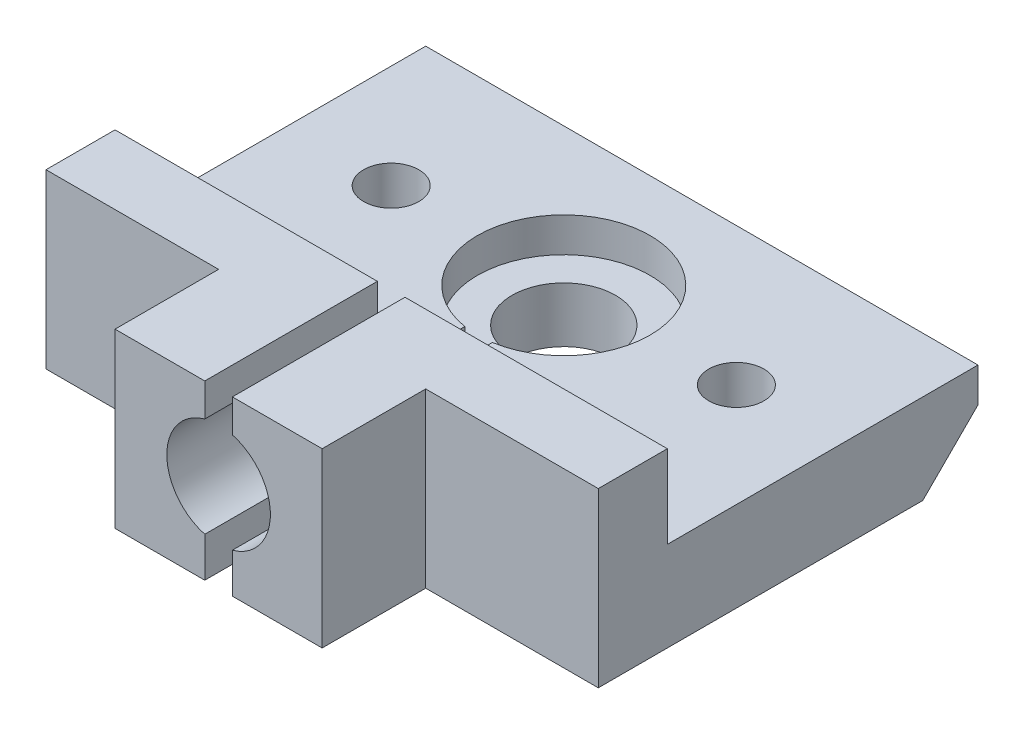
ISO-10303-21;
HEADER;
FILE_DESCRIPTION(('STEP AP214'),'2;1');
FILE_NAME('part.step','',(''),(''),'','','');
FILE_SCHEMA(('AUTOMOTIVE_DESIGN { 1 0 10303 214 1 1 1 1 }'));
ENDSEC;
DATA;
#1=APPLICATION_CONTEXT('core data for automotive mechanical design processes');
#2=APPLICATION_PROTOCOL_DEFINITION('international standard','automotive_design',2000,#1);
#3=PRODUCT_CONTEXT('',#1,'mechanical');
#4=PRODUCT('Part','Part','',(#3));
#5=PRODUCT_RELATED_PRODUCT_CATEGORY('part','',(#4));
#6=PRODUCT_DEFINITION_FORMATION('','',#4);
#7=PRODUCT_DEFINITION_CONTEXT('part definition',#1,'design');
#8=PRODUCT_DEFINITION('design','',#6,#7);
#9=PRODUCT_DEFINITION_SHAPE('','',#8);
#10=(LENGTH_UNIT() NAMED_UNIT(*) SI_UNIT(.MILLI.,.METRE.));
#11=(NAMED_UNIT(*) PLANE_ANGLE_UNIT() SI_UNIT($,.RADIAN.));
#12=(NAMED_UNIT(*) SI_UNIT($,.STERADIAN.) SOLID_ANGLE_UNIT());
#13=UNCERTAINTY_MEASURE_WITH_UNIT(LENGTH_MEASURE(1.E-05),#10,'distance_accuracy_value','');
#14=(GEOMETRIC_REPRESENTATION_CONTEXT(3) GLOBAL_UNCERTAINTY_ASSIGNED_CONTEXT((#13)) GLOBAL_UNIT_ASSIGNED_CONTEXT((#10,
#11,#12)) REPRESENTATION_CONTEXT('',''));
#15=CARTESIAN_POINT('',(0.,0.,0.));
#16=DIRECTION('',(0.,0.,1.));
#17=DIRECTION('',(1.,0.,0.));
#18=AXIS2_PLACEMENT_3D('',#15,#16,#17);
#19=CARTESIAN_POINT('',(40.,-12.,-50.));
#20=DIRECTION('',(0.,1.,0.));
#21=DIRECTION('',(0.,0.,1.));
#22=AXIS2_PLACEMENT_3D('',#19,#20,#21);
#23=CYLINDRICAL_SURFACE('',#22,7.5);
#24=DIRECTION('',(0.,1.,0.));
#25=VECTOR('',#24,1.);
#26=CARTESIAN_POINT('',(38.,-12.,-42.7715838525995));
#27=LINE('',#26,#25);
#28=CARTESIAN_POINT('',(38.,0.,-42.7715838525995));
#29=VERTEX_POINT('',#28);
#30=CARTESIAN_POINT('',(38.,8.00000000000001,-42.7715838525995));
#31=VERTEX_POINT('',#30);
#32=EDGE_CURVE('E225',#29,#31,#27,.T.);
#33=ORIENTED_EDGE('',*,*,#32,.F.);
#34=CARTESIAN_POINT('',(40.,0.,-50.));
#35=DIRECTION('',(0.,1.,0.));
#36=DIRECTION('',(0.,0.,1.));
#37=AXIS2_PLACEMENT_3D('',#34,#35,#36);
#38=CIRCLE('',#37,7.5);
#39=CARTESIAN_POINT('',(42.,0.,-42.7715838525995));
#40=VERTEX_POINT('',#39);
#41=EDGE_CURVE('E243',#40,#29,#38,.T.);
#42=ORIENTED_EDGE('',*,*,#41,.F.);
#43=DIRECTION('',(0.,1.,0.));
#44=VECTOR('',#43,1.);
#45=CARTESIAN_POINT('',(42.,-12.,-42.7715838525995));
#46=LINE('',#45,#44);
#47=CARTESIAN_POINT('',(42.,8.00000000000001,-42.7715838525995));
#48=VERTEX_POINT('',#47);
#49=EDGE_CURVE('E458',#40,#48,#46,.T.);
#50=ORIENTED_EDGE('',*,*,#49,.T.);
#51=CARTESIAN_POINT('',(40.,8.00000000000001,-50.));
#52=DIRECTION('',(0.,1.,0.));
#53=DIRECTION('',(0.,0.,1.));
#54=AXIS2_PLACEMENT_3D('',#51,#52,#53);
#55=CIRCLE('',#54,7.5);
#56=EDGE_CURVE('E237',#31,#48,#55,.F.);
#57=ORIENTED_EDGE('',*,*,#56,.F.);
#58=EDGE_LOOP('',(#33,#42,#50,#57));
#59=FACE_BOUND('',#58,.T.);
#60=ADVANCED_FACE('F37',(#59),#23,.F.);
#61=CARTESIAN_POINT('',(25.,25.,0.));
#62=DIRECTION('',(0.,0.,-1.));
#63=DIRECTION('',(-1.,0.,0.));
#64=AXIS2_PLACEMENT_3D('',#61,#62,#63);
#65=PLANE('',#64);
#66=DIRECTION('',(0.,-1.,0.));
#67=VECTOR('',#66,1.);
#68=CARTESIAN_POINT('',(38.,25.,0.));
#69=LINE('',#68,#67);
#70=CARTESIAN_POINT('',(38.,5.77158385259952,0.));
#71=VERTEX_POINT('',#70);
#72=CARTESIAN_POINT('',(38.,0.,0.));
#73=VERTEX_POINT('',#72);
#74=EDGE_CURVE('E229',#71,#73,#69,.T.);
#75=ORIENTED_EDGE('',*,*,#74,.F.);
#76=CARTESIAN_POINT('',(40.,13.,0.));
#77=DIRECTION('',(0.,0.,1.));
#78=DIRECTION('',(1.,0.,0.));
#79=AXIS2_PLACEMENT_3D('',#76,#77,#78);
#80=CIRCLE('',#79,7.5);
#81=CARTESIAN_POINT('',(38.,20.2284161474005,0.));
#82=VERTEX_POINT('',#81);
#83=EDGE_CURVE('E200',#82,#71,#80,.T.);
#84=ORIENTED_EDGE('',*,*,#83,.F.);
#85=CARTESIAN_POINT('',(38.,25.,0.));
#86=VERTEX_POINT('',#85);
#87=EDGE_CURVE('E230',#86,#82,#69,.T.);
#88=ORIENTED_EDGE('',*,*,#87,.F.);
#89=DIRECTION('',(1.,0.,0.));
#90=VECTOR('',#89,1.);
#91=CARTESIAN_POINT('',(25.,25.,0.));
#92=LINE('',#91,#90);
#93=CARTESIAN_POINT('',(25.,25.,0.));
#94=VERTEX_POINT('',#93);
#95=EDGE_CURVE('E286',#94,#86,#92,.T.);
#96=ORIENTED_EDGE('',*,*,#95,.F.);
#97=DIRECTION('',(0.,-1.,0.));
#98=VECTOR('',#97,1.);
#99=CARTESIAN_POINT('',(25.,25.,0.));
#100=LINE('',#99,#98);
#101=CARTESIAN_POINT('',(25.,0.,0.));
#102=VERTEX_POINT('',#101);
#103=EDGE_CURVE('E316',#94,#102,#100,.T.);
#104=ORIENTED_EDGE('',*,*,#103,.T.);
#105=DIRECTION('',(1.,0.,0.));
#106=VECTOR('',#105,1.);
#107=CARTESIAN_POINT('',(25.,0.,0.));
#108=LINE('',#107,#106);
#109=EDGE_CURVE('E307',#102,#73,#108,.T.);
#110=ORIENTED_EDGE('',*,*,#109,.T.);
#111=EDGE_LOOP('',(#75,#84,#88,#96,#104,#110));
#112=FACE_BOUND('',#111,.T.);
#113=ADVANCED_FACE('F376',(#112),#65,.F.);
#114=CARTESIAN_POINT('',(0.,25.,0.));
#115=DIRECTION('',(0.,1.,0.));
#116=DIRECTION('',(0.,0.,1.));
#117=AXIS2_PLACEMENT_3D('',#114,#115,#116);
#118=PLANE('',#117);
#119=ORIENTED_EDGE('',*,*,#95,.T.);
#120=DIRECTION('',(0.,0.,-1.));
#121=VECTOR('',#120,1.);
#122=CARTESIAN_POINT('',(38.,25.,1.20277837918589));
#123=LINE('',#122,#121);
#124=CARTESIAN_POINT('',(38.,25.,-25.));
#125=VERTEX_POINT('',#124);
#126=EDGE_CURVE('E454',#86,#125,#123,.T.);
#127=ORIENTED_EDGE('',*,*,#126,.T.);
#128=DIRECTION('',(1.,0.,0.));
#129=VECTOR('',#128,1.);
#130=CARTESIAN_POINT('',(0.,25.,-25.));
#131=LINE('',#130,#129);
#132=CARTESIAN_POINT('',(0.,25.,-25.));
#133=VERTEX_POINT('',#132);
#134=EDGE_CURVE('E332',#133,#125,#131,.T.);
#135=ORIENTED_EDGE('',*,*,#134,.F.);
#136=DIRECTION('',(0.,0.,-1.));
#137=VECTOR('',#136,1.);
#138=CARTESIAN_POINT('',(0.,25.,-15.));
#139=LINE('',#138,#137);
#140=CARTESIAN_POINT('',(0.,25.,-15.));
#141=VERTEX_POINT('',#140);
#142=EDGE_CURVE('E278',#141,#133,#139,.T.);
#143=ORIENTED_EDGE('',*,*,#142,.F.);
#144=DIRECTION('',(1.,0.,0.));
#145=VECTOR('',#144,1.);
#146=CARTESIAN_POINT('',(0.,25.,-15.));
#147=LINE('',#146,#145);
#148=CARTESIAN_POINT('',(25.,25.,-15.));
#149=VERTEX_POINT('',#148);
#150=EDGE_CURVE('E281',#141,#149,#147,.T.);
#151=ORIENTED_EDGE('',*,*,#150,.T.);
#152=DIRECTION('',(0.,0.,-1.));
#153=VECTOR('',#152,1.);
#154=CARTESIAN_POINT('',(25.,25.,0.));
#155=LINE('',#154,#153);
#156=EDGE_CURVE('E283',#94,#149,#155,.T.);
#157=ORIENTED_EDGE('',*,*,#156,.F.);
#158=EDGE_LOOP('',(#119,#127,#135,#143,#151,#157));
#159=FACE_BOUND('',#158,.T.);
#160=ADVANCED_FACE('F382',(#159),#118,.T.);
#161=CARTESIAN_POINT('',(0.,0.,0.));
#162=DIRECTION('',(0.,1.,0.));
#163=DIRECTION('',(0.,0.,1.));
#164=AXIS2_PLACEMENT_3D('',#161,#162,#163);
#165=PLANE('',#164);
#166=CARTESIAN_POINT('',(65.,0.,-50.));
#167=DIRECTION('',(0.,1.,0.));
#168=DIRECTION('',(0.,0.,1.));
#169=AXIS2_PLACEMENT_3D('',#166,#167,#168);
#170=CIRCLE('',#169,4.00000000000001);
#171=CARTESIAN_POINT('',(65.,0.,-46.));
#172=VERTEX_POINT('',#171);
#173=EDGE_CURVE('E249',#172,#172,#170,.T.);
#174=ORIENTED_EDGE('',*,*,#173,.T.);
#175=EDGE_LOOP('',(#174));
#176=FACE_BOUND('',#175,.T.);
#177=CARTESIAN_POINT('',(15.,0.,-50.));
#178=DIRECTION('',(0.,1.,0.));
#179=DIRECTION('',(0.,0.,1.));
#180=AXIS2_PLACEMENT_3D('',#177,#178,#179);
#181=CIRCLE('',#180,4.);
#182=CARTESIAN_POINT('',(15.,0.,-46.));
#183=VERTEX_POINT('',#182);
#184=EDGE_CURVE('E252',#183,#183,#181,.T.);
#185=ORIENTED_EDGE('',*,*,#184,.T.);
#186=EDGE_LOOP('',(#185));
#187=FACE_BOUND('',#186,.T.);
#188=DIRECTION('',(0.,0.,-1.));
#189=VECTOR('',#188,1.);
#190=CARTESIAN_POINT('',(38.,0.,1.20277837918589));
#191=LINE('',#190,#189);
#192=EDGE_CURVE('E453',#73,#29,#191,.T.);
#193=ORIENTED_EDGE('',*,*,#192,.F.);
#194=ORIENTED_EDGE('',*,*,#109,.F.);
#195=DIRECTION('',(0.,0.,-1.));
#196=VECTOR('',#195,1.);
#197=CARTESIAN_POINT('',(25.,0.,0.));
#198=LINE('',#197,#196);
#199=CARTESIAN_POINT('',(25.,0.,-15.));
#200=VERTEX_POINT('',#199);
#201=EDGE_CURVE('E303',#102,#200,#198,.T.);
#202=ORIENTED_EDGE('',*,*,#201,.T.);
#203=DIRECTION('',(1.,0.,0.));
#204=VECTOR('',#203,1.);
#205=CARTESIAN_POINT('',(0.,0.,-15.));
#206=LINE('',#205,#204);
#207=CARTESIAN_POINT('',(0.,0.,-15.));
#208=VERTEX_POINT('',#207);
#209=EDGE_CURVE('E300',#208,#200,#206,.T.);
#210=ORIENTED_EDGE('',*,*,#209,.F.);
#211=DIRECTION('',(0.,0.,-1.));
#212=VECTOR('',#211,1.);
#213=CARTESIAN_POINT('',(0.,0.,-15.));
#214=LINE('',#213,#212);
#215=CARTESIAN_POINT('',(0.,0.,-62.));
#216=VERTEX_POINT('',#215);
#217=EDGE_CURVE('E297',#208,#216,#214,.T.);
#218=ORIENTED_EDGE('',*,*,#217,.T.);
#219=DIRECTION('',(1.,0.,0.));
#220=VECTOR('',#219,1.);
#221=CARTESIAN_POINT('',(80.,0.,-62.));
#222=LINE('',#221,#220);
#223=CARTESIAN_POINT('',(80.,0.,-62.));
#224=VERTEX_POINT('',#223);
#225=EDGE_CURVE('E338',#216,#224,#222,.T.);
#226=ORIENTED_EDGE('',*,*,#225,.T.);
#227=DIRECTION('',(0.,0.,-1.));
#228=VECTOR('',#227,1.);
#229=CARTESIAN_POINT('',(80.,0.,-15.));
#230=LINE('',#229,#228);
#231=CARTESIAN_POINT('',(80.,0.,-15.));
#232=VERTEX_POINT('',#231);
#233=EDGE_CURVE('E294',#232,#224,#230,.T.);
#234=ORIENTED_EDGE('',*,*,#233,.F.);
#235=DIRECTION('',(1.,0.,0.));
#236=VECTOR('',#235,1.);
#237=CARTESIAN_POINT('',(55.,0.,-15.));
#238=LINE('',#237,#236);
#239=CARTESIAN_POINT('',(55.,0.,-15.));
#240=VERTEX_POINT('',#239);
#241=EDGE_CURVE('E270',#240,#232,#238,.T.);
#242=ORIENTED_EDGE('',*,*,#241,.F.);
#243=DIRECTION('',(0.,0.,-1.));
#244=VECTOR('',#243,1.);
#245=CARTESIAN_POINT('',(55.,0.,0.));
#246=LINE('',#245,#244);
#247=CARTESIAN_POINT('',(55.,0.,0.));
#248=VERTEX_POINT('',#247);
#249=EDGE_CURVE('E275',#248,#240,#246,.T.);
#250=ORIENTED_EDGE('',*,*,#249,.F.);
#251=CARTESIAN_POINT('',(42.,0.,0.));
#252=VERTEX_POINT('',#251);
#253=EDGE_CURVE('E306',#252,#248,#108,.T.);
#254=ORIENTED_EDGE('',*,*,#253,.F.);
#255=DIRECTION('',(0.,0.,-1.));
#256=VECTOR('',#255,1.);
#257=CARTESIAN_POINT('',(42.,0.,1.20277837918589));
#258=LINE('',#257,#256);
#259=EDGE_CURVE('E451',#252,#40,#258,.T.);
#260=ORIENTED_EDGE('',*,*,#259,.T.);
#261=ORIENTED_EDGE('',*,*,#41,.T.);
#262=EDGE_LOOP('',(#193,#194,#202,#210,#218,#226,#234,#242,#250,#254,#260,#261));
#263=FACE_BOUND('',#262,.T.);
#264=ADVANCED_FACE('F399',(#176,#187,#263),#165,.F.);
#265=CARTESIAN_POINT('',(-1.2E-05,13.,-70.));
#266=DIRECTION('',(0.,1.,0.));
#267=DIRECTION('',(0.,0.,1.));
#268=AXIS2_PLACEMENT_3D('',#265,#266,#267);
#269=PLANE('',#268);
#270=CARTESIAN_POINT('',(15.,13.,-50.));
#271=DIRECTION('',(0.,1.,0.));
#272=DIRECTION('',(0.,0.,1.));
#273=AXIS2_PLACEMENT_3D('',#270,#271,#272);
#274=CIRCLE('',#273,4.);
#275=CARTESIAN_POINT('',(15.,13.,-46.));
#276=VERTEX_POINT('',#275);
#277=EDGE_CURVE('E244',#276,#276,#274,.T.);
#278=ORIENTED_EDGE('',*,*,#277,.F.);
#279=EDGE_LOOP('',(#278));
#280=FACE_BOUND('',#279,.T.);
#281=CARTESIAN_POINT('',(65.,13.,-50.));
#282=DIRECTION('',(0.,1.,0.));
#283=DIRECTION('',(0.,0.,1.));
#284=AXIS2_PLACEMENT_3D('',#281,#282,#283);
#285=CIRCLE('',#284,4.00000000000001);
#286=CARTESIAN_POINT('',(65.,13.,-46.));
#287=VERTEX_POINT('',#286);
#288=EDGE_CURVE('E240',#287,#287,#285,.T.);
#289=ORIENTED_EDGE('',*,*,#288,.F.);
#290=EDGE_LOOP('',(#289));
#291=FACE_BOUND('',#290,.T.);
#292=DIRECTION('',(1.,0.,0.));
#293=VECTOR('',#292,1.);
#294=CARTESIAN_POINT('',(-1.2E-05,13.,-25.));
#295=LINE('',#294,#293);
#296=CARTESIAN_POINT('',(0.,13.,-25.));
#297=VERTEX_POINT('',#296);
#298=CARTESIAN_POINT('',(38.,13.,-25.));
#299=VERTEX_POINT('',#298);
#300=EDGE_CURVE('E262',#297,#299,#295,.T.);
#301=ORIENTED_EDGE('',*,*,#300,.T.);
#302=DIRECTION('',(0.,0.,-1.));
#303=VECTOR('',#302,1.);
#304=CARTESIAN_POINT('',(38.,13.,-70.));
#305=LINE('',#304,#303);
#306=CARTESIAN_POINT('',(38.,13.,-37.6610373207469));
#307=VERTEX_POINT('',#306);
#308=EDGE_CURVE('E217',#299,#307,#305,.T.);
#309=ORIENTED_EDGE('',*,*,#308,.T.);
#310=CARTESIAN_POINT('',(40.,13.,-50.));
#311=DIRECTION('',(0.,1.,0.));
#312=DIRECTION('',(0.,0.,1.));
#313=AXIS2_PLACEMENT_3D('',#310,#311,#312);
#314=CIRCLE('',#313,12.5);
#315=CARTESIAN_POINT('',(42.,13.,-37.6610373207469));
#316=VERTEX_POINT('',#315);
#317=EDGE_CURVE('E233',#316,#307,#314,.T.);
#318=ORIENTED_EDGE('',*,*,#317,.F.);
#319=DIRECTION('',(0.,0.,-1.));
#320=VECTOR('',#319,1.);
#321=CARTESIAN_POINT('',(42.,13.,-70.));
#322=LINE('',#321,#320);
#323=CARTESIAN_POINT('',(42.,13.,-25.));
#324=VERTEX_POINT('',#323);
#325=EDGE_CURVE('E489',#324,#316,#322,.T.);
#326=ORIENTED_EDGE('',*,*,#325,.F.);
#327=CARTESIAN_POINT('',(80.,13.,-25.));
#328=VERTEX_POINT('',#327);
#329=EDGE_CURVE('E261',#324,#328,#295,.T.);
#330=ORIENTED_EDGE('',*,*,#329,.T.);
#331=DIRECTION('',(0.,0.,1.));
#332=VECTOR('',#331,1.);
#333=CARTESIAN_POINT('',(80.,13.,-70.));
#334=LINE('',#333,#332);
#335=CARTESIAN_POINT('',(80.,13.,-70.));
#336=VERTEX_POINT('',#335);
#337=EDGE_CURVE('E255',#336,#328,#334,.T.);
#338=ORIENTED_EDGE('',*,*,#337,.F.);
#339=DIRECTION('',(1.,0.,0.));
#340=VECTOR('',#339,1.);
#341=CARTESIAN_POINT('',(-1.2E-05,13.,-70.));
#342=LINE('',#341,#340);
#343=CARTESIAN_POINT('',(0.,13.,-70.));
#344=VERTEX_POINT('',#343);
#345=EDGE_CURVE('E265',#344,#336,#342,.T.);
#346=ORIENTED_EDGE('',*,*,#345,.F.);
#347=DIRECTION('',(0.,0.,-1.));
#348=VECTOR('',#347,1.);
#349=CARTESIAN_POINT('',(0.,13.,-15.));
#350=LINE('',#349,#348);
#351=EDGE_CURVE('E335',#297,#344,#350,.T.);
#352=ORIENTED_EDGE('',*,*,#351,.F.);
#353=EDGE_LOOP('',(#301,#309,#318,#326,#330,#338,#346,#352));
#354=FACE_BOUND('',#353,.T.);
#355=ADVANCED_FACE('F396',(#280,#291,#354),#269,.T.);
#356=CARTESIAN_POINT('',(-1.2E-05,25.,-25.));
#357=DIRECTION('',(0.,0.,1.));
#358=DIRECTION('',(1.,0.,0.));
#359=AXIS2_PLACEMENT_3D('',#356,#357,#358);
#360=PLANE('',#359);
#361=DIRECTION('',(0.,1.,0.));
#362=VECTOR('',#361,1.);
#363=CARTESIAN_POINT('',(38.,25.,-25.));
#364=LINE('',#363,#362);
#365=EDGE_CURVE('E227',#299,#125,#364,.T.);
#366=ORIENTED_EDGE('',*,*,#365,.F.);
#367=ORIENTED_EDGE('',*,*,#300,.F.);
#368=DIRECTION('',(0.,1.,0.));
#369=VECTOR('',#368,1.);
#370=CARTESIAN_POINT('',(0.,25.,-25.));
#371=LINE('',#370,#369);
#372=EDGE_CURVE('E268',#297,#133,#371,.T.);
#373=ORIENTED_EDGE('',*,*,#372,.T.);
#374=ORIENTED_EDGE('',*,*,#134,.T.);
#375=EDGE_LOOP('',(#366,#367,#373,#374));
#376=FACE_BOUND('',#375,.T.);
#377=ADVANCED_FACE('F395',(#376),#360,.F.);
#378=CARTESIAN_POINT('',(40.,8.,-50.));
#379=DIRECTION('',(0.,1.,0.));
#380=DIRECTION('',(0.,0.,1.));
#381=AXIS2_PLACEMENT_3D('',#378,#379,#380);
#382=PLANE('',#381);
#383=CARTESIAN_POINT('',(40.,8.,-50.));
#384=DIRECTION('',(0.,1.,0.));
#385=DIRECTION('',(0.,0.,1.));
#386=AXIS2_PLACEMENT_3D('',#383,#384,#385);
#387=CIRCLE('',#386,12.5);
#388=CARTESIAN_POINT('',(42.,8.,-37.6610373207469));
#389=VERTEX_POINT('',#388);
#390=CARTESIAN_POINT('',(38.,8.,-37.6610373207469));
#391=VERTEX_POINT('',#390);
#392=EDGE_CURVE('E234',#389,#391,#387,.T.);
#393=ORIENTED_EDGE('',*,*,#392,.T.);
#394=DIRECTION('',(0.,0.,-1.));
#395=VECTOR('',#394,1.);
#396=CARTESIAN_POINT('',(38.,8.,-50.));
#397=LINE('',#396,#395);
#398=EDGE_CURVE('E213',#391,#31,#397,.T.);
#399=ORIENTED_EDGE('',*,*,#398,.T.);
#400=ORIENTED_EDGE('',*,*,#56,.T.);
#401=DIRECTION('',(0.,0.,-1.));
#402=VECTOR('',#401,1.);
#403=CARTESIAN_POINT('',(42.,8.,-50.));
#404=LINE('',#403,#402);
#405=EDGE_CURVE('E464',#389,#48,#404,.T.);
#406=ORIENTED_EDGE('',*,*,#405,.F.);
#407=EDGE_LOOP('',(#393,#399,#400,#406));
#408=FACE_BOUND('',#407,.T.);
#409=ADVANCED_FACE('F461',(#408),#382,.T.);
#410=CARTESIAN_POINT('',(40.,8.,-50.));
#411=DIRECTION('',(0.,1.,0.));
#412=DIRECTION('',(0.,0.,1.));
#413=AXIS2_PLACEMENT_3D('',#410,#411,#412);
#414=CYLINDRICAL_SURFACE('',#413,12.5);
#415=DIRECTION('',(0.,1.,0.));
#416=VECTOR('',#415,1.);
#417=CARTESIAN_POINT('',(38.,8.,-37.6610373207469));
#418=LINE('',#417,#416);
#419=EDGE_CURVE('E352',#391,#307,#418,.T.);
#420=ORIENTED_EDGE('',*,*,#419,.F.);
#421=ORIENTED_EDGE('',*,*,#392,.F.);
#422=DIRECTION('',(0.,1.,0.));
#423=VECTOR('',#422,1.);
#424=CARTESIAN_POINT('',(42.,8.,-37.6610373207469));
#425=LINE('',#424,#423);
#426=EDGE_CURVE('E347',#389,#316,#425,.T.);
#427=ORIENTED_EDGE('',*,*,#426,.T.);
#428=ORIENTED_EDGE('',*,*,#317,.T.);
#429=EDGE_LOOP('',(#420,#421,#427,#428));
#430=FACE_BOUND('',#429,.T.);
#431=ADVANCED_FACE('F431',(#430),#414,.F.);
#432=CARTESIAN_POINT('',(80.,25.,-15.));
#433=DIRECTION('',(-1.,0.,0.));
#434=DIRECTION('',(0.,0.,1.));
#435=AXIS2_PLACEMENT_3D('',#432,#433,#434);
#436=PLANE('',#435);
#437=ORIENTED_EDGE('',*,*,#233,.T.);
#438=DIRECTION('',(0.,0.707106781186549,-0.707106781186546));
#439=VECTOR('',#438,1.);
#440=CARTESIAN_POINT('',(80.,0.,-62.));
#441=LINE('',#440,#439);
#442=CARTESIAN_POINT('',(80.,8.00000000000002,-70.));
#443=VERTEX_POINT('',#442);
#444=EDGE_CURVE('E341',#224,#443,#441,.T.);
#445=ORIENTED_EDGE('',*,*,#444,.T.);
#446=DIRECTION('',(0.,-1.,0.));
#447=VECTOR('',#446,1.);
#448=CARTESIAN_POINT('',(80.,25.,-70.));
#449=LINE('',#448,#447);
#450=EDGE_CURVE('E325',#336,#443,#449,.T.);
#451=ORIENTED_EDGE('',*,*,#450,.F.);
#452=ORIENTED_EDGE('',*,*,#337,.T.);
#453=DIRECTION('',(0.,-1.,0.));
#454=VECTOR('',#453,1.);
#455=CARTESIAN_POINT('',(80.,25.,-25.));
#456=LINE('',#455,#454);
#457=CARTESIAN_POINT('',(80.,25.,-25.));
#458=VERTEX_POINT('',#457);
#459=EDGE_CURVE('E258',#458,#328,#456,.T.);
#460=ORIENTED_EDGE('',*,*,#459,.F.);
#461=DIRECTION('',(0.,0.,-1.));
#462=VECTOR('',#461,1.);
#463=CARTESIAN_POINT('',(80.,25.,-15.));
#464=LINE('',#463,#462);
#465=CARTESIAN_POINT('',(80.,25.,-15.));
#466=VERTEX_POINT('',#465);
#467=EDGE_CURVE('E274',#466,#458,#464,.T.);
#468=ORIENTED_EDGE('',*,*,#467,.F.);
#469=DIRECTION('',(0.,-1.,0.));
#470=VECTOR('',#469,1.);
#471=CARTESIAN_POINT('',(80.,25.,-15.));
#472=LINE('',#471,#470);
#473=EDGE_CURVE('E328',#466,#232,#472,.T.);
#474=ORIENTED_EDGE('',*,*,#473,.T.);
#475=EDGE_LOOP('',(#437,#445,#451,#452,#460,#468,#474));
#476=FACE_BOUND('',#475,.T.);
#477=ADVANCED_FACE('F428',(#476),#436,.F.);
#478=CARTESIAN_POINT('',(0.,25.,-70.));
#479=DIRECTION('',(0.,0.,-1.));
#480=DIRECTION('',(-1.,0.,0.));
#481=AXIS2_PLACEMENT_3D('',#478,#479,#480);
#482=PLANE('',#481);
#483=ORIENTED_EDGE('',*,*,#450,.T.);
#484=DIRECTION('',(-1.,0.,0.));
#485=VECTOR('',#484,1.);
#486=CARTESIAN_POINT('',(0.,8.00000000000002,-70.));
#487=LINE('',#486,#485);
#488=CARTESIAN_POINT('',(0.,8.00000000000002,-70.));
#489=VERTEX_POINT('',#488);
#490=EDGE_CURVE('E343',#443,#489,#487,.T.);
#491=ORIENTED_EDGE('',*,*,#490,.T.);
#492=DIRECTION('',(0.,-1.,0.));
#493=VECTOR('',#492,1.);
#494=CARTESIAN_POINT('',(0.,25.,-70.));
#495=LINE('',#494,#493);
#496=EDGE_CURVE('E322',#344,#489,#495,.T.);
#497=ORIENTED_EDGE('',*,*,#496,.F.);
#498=ORIENTED_EDGE('',*,*,#345,.T.);
#499=EDGE_LOOP('',(#483,#491,#497,#498));
#500=FACE_BOUND('',#499,.T.);
#501=ADVANCED_FACE('F424',(#500),#482,.T.);
#502=CARTESIAN_POINT('',(0.,25.,-15.));
#503=DIRECTION('',(-1.,0.,0.));
#504=DIRECTION('',(0.,0.,1.));
#505=AXIS2_PLACEMENT_3D('',#502,#503,#504);
#506=PLANE('',#505);
#507=ORIENTED_EDGE('',*,*,#496,.T.);
#508=DIRECTION('',(0.,-0.707106781186549,0.707106781186546));
#509=VECTOR('',#508,1.);
#510=CARTESIAN_POINT('',(0.,-11.,-51.0000000000001));
#511=LINE('',#510,#509);
#512=EDGE_CURVE('E345',#489,#216,#511,.T.);
#513=ORIENTED_EDGE('',*,*,#512,.T.);
#514=ORIENTED_EDGE('',*,*,#217,.F.);
#515=DIRECTION('',(0.,-1.,0.));
#516=VECTOR('',#515,1.);
#517=CARTESIAN_POINT('',(0.,25.,-15.));
#518=LINE('',#517,#516);
#519=EDGE_CURVE('E320',#141,#208,#518,.T.);
#520=ORIENTED_EDGE('',*,*,#519,.F.);
#521=ORIENTED_EDGE('',*,*,#142,.T.);
#522=ORIENTED_EDGE('',*,*,#372,.F.);
#523=ORIENTED_EDGE('',*,*,#351,.T.);
#524=EDGE_LOOP('',(#507,#513,#514,#520,#521,#522,#523));
#525=FACE_BOUND('',#524,.T.);
#526=ADVANCED_FACE('F421',(#525),#506,.T.);
#527=CARTESIAN_POINT('',(55.,25.,-15.));
#528=DIRECTION('',(0.,0.,-1.));
#529=DIRECTION('',(-1.,0.,0.));
#530=AXIS2_PLACEMENT_3D('',#527,#528,#529);
#531=PLANE('',#530);
#532=ORIENTED_EDGE('',*,*,#241,.T.);
#533=ORIENTED_EDGE('',*,*,#473,.F.);
#534=DIRECTION('',(1.,0.,0.));
#535=VECTOR('',#534,1.);
#536=CARTESIAN_POINT('',(55.,25.,-15.));
#537=LINE('',#536,#535);
#538=CARTESIAN_POINT('',(55.,25.,-15.));
#539=VERTEX_POINT('',#538);
#540=EDGE_CURVE('E271',#539,#466,#537,.T.);
#541=ORIENTED_EDGE('',*,*,#540,.F.);
#542=DIRECTION('',(0.,-1.,0.));
#543=VECTOR('',#542,1.);
#544=CARTESIAN_POINT('',(55.,25.,-15.));
#545=LINE('',#544,#543);
#546=EDGE_CURVE('E291',#539,#240,#545,.T.);
#547=ORIENTED_EDGE('',*,*,#546,.T.);
#548=EDGE_LOOP('',(#532,#533,#541,#547));
#549=FACE_BOUND('',#548,.T.);
#550=ADVANCED_FACE('F419',(#549),#531,.F.);
#551=CARTESIAN_POINT('',(0.,25.,-15.));
#552=DIRECTION('',(0.,0.,-1.));
#553=DIRECTION('',(-1.,0.,0.));
#554=AXIS2_PLACEMENT_3D('',#551,#552,#553);
#555=PLANE('',#554);
#556=ORIENTED_EDGE('',*,*,#209,.T.);
#557=DIRECTION('',(0.,-1.,0.));
#558=VECTOR('',#557,1.);
#559=CARTESIAN_POINT('',(25.,25.,-15.));
#560=LINE('',#559,#558);
#561=EDGE_CURVE('E318',#149,#200,#560,.T.);
#562=ORIENTED_EDGE('',*,*,#561,.F.);
#563=ORIENTED_EDGE('',*,*,#150,.F.);
#564=ORIENTED_EDGE('',*,*,#519,.T.);
#565=EDGE_LOOP('',(#556,#562,#563,#564));
#566=FACE_BOUND('',#565,.T.);
#567=ADVANCED_FACE('F415',(#566),#555,.F.);
#568=CARTESIAN_POINT('',(25.,25.,0.));
#569=DIRECTION('',(-1.,0.,0.));
#570=DIRECTION('',(0.,0.,1.));
#571=AXIS2_PLACEMENT_3D('',#568,#569,#570);
#572=PLANE('',#571);
#573=ORIENTED_EDGE('',*,*,#201,.F.);
#574=ORIENTED_EDGE('',*,*,#103,.F.);
#575=ORIENTED_EDGE('',*,*,#156,.T.);
#576=ORIENTED_EDGE('',*,*,#561,.T.);
#577=EDGE_LOOP('',(#573,#574,#575,#576));
#578=FACE_BOUND('',#577,.T.);
#579=ADVANCED_FACE('F412',(#578),#572,.T.);
#580=DIRECTION('',(0.,-1.,0.));
#581=VECTOR('',#580,1.);
#582=CARTESIAN_POINT('',(42.,25.,0.));
#583=LINE('',#582,#581);
#584=CARTESIAN_POINT('',(42.,25.,0.));
#585=VERTEX_POINT('',#584);
#586=CARTESIAN_POINT('',(42.,20.2284161474005,0.));
#587=VERTEX_POINT('',#586);
#588=EDGE_CURVE('E204',#585,#587,#583,.T.);
#589=ORIENTED_EDGE('',*,*,#588,.T.);
#590=CARTESIAN_POINT('',(42.,5.77158385259952,0.));
#591=VERTEX_POINT('',#590);
#592=EDGE_CURVE('E190',#591,#587,#80,.T.);
#593=ORIENTED_EDGE('',*,*,#592,.F.);
#594=EDGE_CURVE('E214',#591,#252,#583,.T.);
#595=ORIENTED_EDGE('',*,*,#594,.T.);
#596=ORIENTED_EDGE('',*,*,#253,.T.);
#597=DIRECTION('',(0.,-1.,0.));
#598=VECTOR('',#597,1.);
#599=CARTESIAN_POINT('',(55.,25.,0.));
#600=LINE('',#599,#598);
#601=CARTESIAN_POINT('',(55.,25.,0.));
#602=VERTEX_POINT('',#601);
#603=EDGE_CURVE('E313',#602,#248,#600,.T.);
#604=ORIENTED_EDGE('',*,*,#603,.F.);
#605=EDGE_CURVE('E212',#585,#602,#92,.T.);
#606=ORIENTED_EDGE('',*,*,#605,.F.);
#607=EDGE_LOOP('',(#589,#593,#595,#596,#604,#606));
#608=FACE_BOUND('',#607,.T.);
#609=ADVANCED_FACE('F210',(#608),#65,.F.);
#610=CARTESIAN_POINT('',(55.,25.,0.));
#611=DIRECTION('',(-1.,0.,0.));
#612=DIRECTION('',(0.,0.,1.));
#613=AXIS2_PLACEMENT_3D('',#610,#611,#612);
#614=PLANE('',#613);
#615=ORIENTED_EDGE('',*,*,#249,.T.);
#616=ORIENTED_EDGE('',*,*,#546,.F.);
#617=DIRECTION('',(0.,0.,-1.));
#618=VECTOR('',#617,1.);
#619=CARTESIAN_POINT('',(55.,25.,0.));
#620=LINE('',#619,#618);
#621=EDGE_CURVE('E289',#602,#539,#620,.T.);
#622=ORIENTED_EDGE('',*,*,#621,.F.);
#623=ORIENTED_EDGE('',*,*,#603,.T.);
#624=EDGE_LOOP('',(#615,#616,#622,#623));
#625=FACE_BOUND('',#624,.T.);
#626=ADVANCED_FACE('F403',(#625),#614,.F.);
#627=DIRECTION('',(0.,0.,-1.));
#628=VECTOR('',#627,1.);
#629=CARTESIAN_POINT('',(42.,25.,1.20277837918589));
#630=LINE('',#629,#628);
#631=CARTESIAN_POINT('',(42.,25.,-25.));
#632=VERTEX_POINT('',#631);
#633=EDGE_CURVE('E207',#585,#632,#630,.T.);
#634=ORIENTED_EDGE('',*,*,#633,.F.);
#635=ORIENTED_EDGE('',*,*,#605,.T.);
#636=ORIENTED_EDGE('',*,*,#621,.T.);
#637=ORIENTED_EDGE('',*,*,#540,.T.);
#638=ORIENTED_EDGE('',*,*,#467,.T.);
#639=EDGE_CURVE('E331',#632,#458,#131,.T.);
#640=ORIENTED_EDGE('',*,*,#639,.F.);
#641=EDGE_LOOP('',(#634,#635,#636,#637,#638,#640));
#642=FACE_BOUND('',#641,.T.);
#643=ADVANCED_FACE('F393',(#642),#118,.T.);
#644=ORIENTED_EDGE('',*,*,#329,.F.);
#645=DIRECTION('',(0.,1.,0.));
#646=VECTOR('',#645,1.);
#647=CARTESIAN_POINT('',(42.,25.,-25.));
#648=LINE('',#647,#646);
#649=EDGE_CURVE('E219',#324,#632,#648,.T.);
#650=ORIENTED_EDGE('',*,*,#649,.T.);
#651=ORIENTED_EDGE('',*,*,#639,.T.);
#652=ORIENTED_EDGE('',*,*,#459,.T.);
#653=EDGE_LOOP('',(#644,#650,#651,#652));
#654=FACE_BOUND('',#653,.T.);
#655=ADVANCED_FACE('F390',(#654),#360,.F.);
#656=CARTESIAN_POINT('',(0.,0.,-62.));
#657=DIRECTION('',(0.,-0.707106781186546,-0.707106781186549));
#658=DIRECTION('',(-1.,0.,0.));
#659=AXIS2_PLACEMENT_3D('',#656,#657,#658);
#660=PLANE('',#659);
#661=ORIENTED_EDGE('',*,*,#512,.F.);
#662=ORIENTED_EDGE('',*,*,#490,.F.);
#663=ORIENTED_EDGE('',*,*,#444,.F.);
#664=ORIENTED_EDGE('',*,*,#225,.F.);
#665=EDGE_LOOP('',(#661,#662,#663,#664));
#666=FACE_BOUND('',#665,.T.);
#667=ADVANCED_FACE('F39',(#666),#660,.T.);
#668=CARTESIAN_POINT('',(65.,-12.,-50.));
#669=DIRECTION('',(0.,1.,0.));
#670=DIRECTION('',(0.,0.,1.));
#671=AXIS2_PLACEMENT_3D('',#668,#669,#670);
#672=CYLINDRICAL_SURFACE('',#671,4.00000000000001);
#673=ORIENTED_EDGE('',*,*,#288,.T.);
#674=EDGE_LOOP('',(#673));
#675=FACE_BOUND('',#674,.T.);
#676=ORIENTED_EDGE('',*,*,#173,.F.);
#677=EDGE_LOOP('',(#676));
#678=FACE_BOUND('',#677,.T.);
#679=ADVANCED_FACE('F503',(#675,#678),#672,.F.);
#680=CARTESIAN_POINT('',(15.,-12.,-50.));
#681=DIRECTION('',(0.,1.,0.));
#682=DIRECTION('',(0.,0.,1.));
#683=AXIS2_PLACEMENT_3D('',#680,#681,#682);
#684=CYLINDRICAL_SURFACE('',#683,4.);
#685=ORIENTED_EDGE('',*,*,#277,.T.);
#686=EDGE_LOOP('',(#685));
#687=FACE_BOUND('',#686,.T.);
#688=ORIENTED_EDGE('',*,*,#184,.F.);
#689=EDGE_LOOP('',(#688));
#690=FACE_BOUND('',#689,.T.);
#691=ADVANCED_FACE('F388',(#687,#690),#684,.F.);
#692=CARTESIAN_POINT('',(42.,0.,1.20277837918589));
#693=DIRECTION('',(1.,0.,0.));
#694=DIRECTION('',(0.,0.,-1.));
#695=AXIS2_PLACEMENT_3D('',#692,#693,#694);
#696=PLANE('',#695);
#697=DIRECTION('',(0.,-1.,0.));
#698=VECTOR('',#697,1.);
#699=CARTESIAN_POINT('',(42.,0.,-15.));
#700=LINE('',#699,#698);
#701=CARTESIAN_POINT('',(42.,20.2284161474005,-15.));
#702=VERTEX_POINT('',#701);
#703=CARTESIAN_POINT('',(42.,5.77158385259952,-15.));
#704=VERTEX_POINT('',#703);
#705=EDGE_CURVE('E206',#702,#704,#700,.T.);
#706=ORIENTED_EDGE('',*,*,#705,.F.);
#707=DIRECTION('',(0.,0.,1.));
#708=VECTOR('',#707,1.);
#709=CARTESIAN_POINT('',(42.,20.2284161474005,-15.));
#710=LINE('',#709,#708);
#711=EDGE_CURVE('E193',#702,#587,#710,.T.);
#712=ORIENTED_EDGE('',*,*,#711,.T.);
#713=ORIENTED_EDGE('',*,*,#588,.F.);
#714=ORIENTED_EDGE('',*,*,#633,.T.);
#715=ORIENTED_EDGE('',*,*,#649,.F.);
#716=ORIENTED_EDGE('',*,*,#325,.T.);
#717=ORIENTED_EDGE('',*,*,#426,.F.);
#718=ORIENTED_EDGE('',*,*,#405,.T.);
#719=ORIENTED_EDGE('',*,*,#49,.F.);
#720=ORIENTED_EDGE('',*,*,#259,.F.);
#721=ORIENTED_EDGE('',*,*,#594,.F.);
#722=DIRECTION('',(0.,0.,1.));
#723=VECTOR('',#722,1.);
#724=CARTESIAN_POINT('',(42.,5.77158385259952,-15.));
#725=LINE('',#724,#723);
#726=EDGE_CURVE('E196',#591,#704,#725,.F.);
#727=ORIENTED_EDGE('',*,*,#726,.T.);
#728=EDGE_LOOP('',(#706,#712,#713,#714,#715,#716,#717,#718,#719,#720,#721,#727));
#729=FACE_BOUND('',#728,.T.);
#730=ADVANCED_FACE('F203',(#729),#696,.F.);
#731=CARTESIAN_POINT('',(38.,0.,1.20277837918589));
#732=DIRECTION('',(1.,0.,0.));
#733=DIRECTION('',(0.,0.,-1.));
#734=AXIS2_PLACEMENT_3D('',#731,#732,#733);
#735=PLANE('',#734);
#736=DIRECTION('',(0.,0.,1.));
#737=VECTOR('',#736,1.);
#738=CARTESIAN_POINT('',(38.,20.2284161474005,-15.));
#739=LINE('',#738,#737);
#740=CARTESIAN_POINT('',(38.,20.2284161474005,-15.));
#741=VERTEX_POINT('',#740);
#742=EDGE_CURVE('E11',#741,#82,#739,.T.);
#743=ORIENTED_EDGE('',*,*,#742,.F.);
#744=DIRECTION('',(0.,-1.,0.));
#745=VECTOR('',#744,1.);
#746=CARTESIAN_POINT('',(38.,0.,-15.));
#747=LINE('',#746,#745);
#748=CARTESIAN_POINT('',(38.,5.77158385259952,-15.));
#749=VERTEX_POINT('',#748);
#750=EDGE_CURVE('E354',#741,#749,#747,.T.);
#751=ORIENTED_EDGE('',*,*,#750,.T.);
#752=DIRECTION('',(0.,0.,1.));
#753=VECTOR('',#752,1.);
#754=CARTESIAN_POINT('',(38.,5.77158385259952,-15.));
#755=LINE('',#754,#753);
#756=EDGE_CURVE('E45',#71,#749,#755,.F.);
#757=ORIENTED_EDGE('',*,*,#756,.F.);
#758=ORIENTED_EDGE('',*,*,#74,.T.);
#759=ORIENTED_EDGE('',*,*,#192,.T.);
#760=ORIENTED_EDGE('',*,*,#32,.T.);
#761=ORIENTED_EDGE('',*,*,#398,.F.);
#762=ORIENTED_EDGE('',*,*,#419,.T.);
#763=ORIENTED_EDGE('',*,*,#308,.F.);
#764=ORIENTED_EDGE('',*,*,#365,.T.);
#765=ORIENTED_EDGE('',*,*,#126,.F.);
#766=ORIENTED_EDGE('',*,*,#87,.T.);
#767=EDGE_LOOP('',(#743,#751,#757,#758,#759,#760,#761,#762,#763,#764,#765,#766));
#768=FACE_BOUND('',#767,.T.);
#769=ADVANCED_FACE('F363',(#768),#735,.T.);
#770=CARTESIAN_POINT('',(40.,13.,-15.));
#771=DIRECTION('',(0.,0.,1.));
#772=DIRECTION('',(1.,0.,0.));
#773=AXIS2_PLACEMENT_3D('',#770,#771,#772);
#774=PLANE('',#773);
#775=CARTESIAN_POINT('',(40.,13.,-15.));
#776=DIRECTION('',(0.,0.,1.));
#777=DIRECTION('',(1.,0.,0.));
#778=AXIS2_PLACEMENT_3D('',#775,#776,#777);
#779=CIRCLE('',#778,7.5);
#780=EDGE_CURVE('E58',#741,#749,#779,.T.);
#781=ORIENTED_EDGE('',*,*,#780,.T.);
#782=ORIENTED_EDGE('',*,*,#750,.F.);
#783=EDGE_LOOP('',(#781,#782));
#784=FACE_BOUND('',#783,.T.);
#785=ADVANCED_FACE('F364',(#784),#774,.T.);
#786=CARTESIAN_POINT('',(40.,13.,-15.));
#787=DIRECTION('',(0.,0.,1.));
#788=DIRECTION('',(1.,0.,0.));
#789=AXIS2_PLACEMENT_3D('',#786,#787,#788);
#790=CYLINDRICAL_SURFACE('',#789,7.5);
#791=ORIENTED_EDGE('',*,*,#742,.T.);
#792=ORIENTED_EDGE('',*,*,#83,.T.);
#793=ORIENTED_EDGE('',*,*,#756,.T.);
#794=ORIENTED_EDGE('',*,*,#780,.F.);
#795=EDGE_LOOP('',(#791,#792,#793,#794));
#796=FACE_BOUND('',#795,.T.);
#797=ADVANCED_FACE('F358',(#796),#790,.F.);
#798=EDGE_CURVE('E51',#704,#702,#779,.T.);
#799=ORIENTED_EDGE('',*,*,#798,.F.);
#800=ORIENTED_EDGE('',*,*,#726,.F.);
#801=ORIENTED_EDGE('',*,*,#592,.T.);
#802=ORIENTED_EDGE('',*,*,#711,.F.);
#803=EDGE_LOOP('',(#799,#800,#801,#802));
#804=FACE_BOUND('',#803,.T.);
#805=ADVANCED_FACE('F192',(#804),#790,.F.);
#806=ORIENTED_EDGE('',*,*,#705,.T.);
#807=ORIENTED_EDGE('',*,*,#798,.T.);
#808=EDGE_LOOP('',(#806,#807));
#809=FACE_BOUND('',#808,.T.);
#810=ADVANCED_FACE('F367',(#809),#774,.T.);
#811=CLOSED_SHELL('',(#60,#113,#160,#264,#355,#377,#409,#431,#477,#501,#526,#550,#567,#579,#609,
#626,#643,#655,#667,#679,#691,#730,#769,#785,#797,#805,#810));
#812=MANIFOLD_SOLID_BREP('B2',#811);
#813=ADVANCED_BREP_SHAPE_REPRESENTATION('',(#18,#812),#14);
#814=SHAPE_DEFINITION_REPRESENTATION(#9,#813);
ENDSEC;
END-ISO-10303-21;
